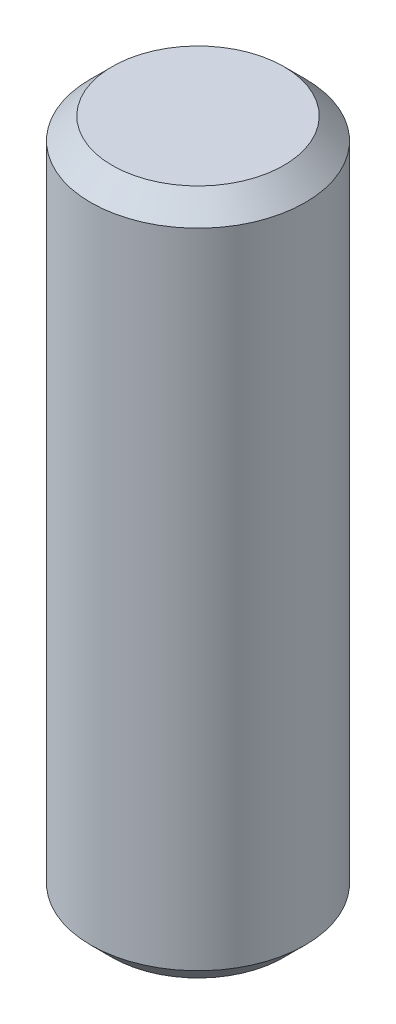
ISO-10303-21;
HEADER;
FILE_DESCRIPTION(('STEP AP214'),'2;1');
FILE_NAME('part.step','',(''),(''),'','','');
FILE_SCHEMA(('AUTOMOTIVE_DESIGN { 1 0 10303 214 1 1 1 1 }'));
ENDSEC;
DATA;
#1=APPLICATION_CONTEXT('core data for automotive mechanical design processes');
#2=APPLICATION_PROTOCOL_DEFINITION('international standard','automotive_design',2000,#1);
#3=PRODUCT_CONTEXT('',#1,'mechanical');
#4=PRODUCT('Part','Part','',(#3));
#5=PRODUCT_RELATED_PRODUCT_CATEGORY('part','',(#4));
#6=PRODUCT_DEFINITION_FORMATION('','',#4);
#7=PRODUCT_DEFINITION_CONTEXT('part definition',#1,'design');
#8=PRODUCT_DEFINITION('design','',#6,#7);
#9=PRODUCT_DEFINITION_SHAPE('','',#8);
#10=(LENGTH_UNIT() NAMED_UNIT(*) SI_UNIT(.MILLI.,.METRE.));
#11=(NAMED_UNIT(*) PLANE_ANGLE_UNIT() SI_UNIT($,.RADIAN.));
#12=(NAMED_UNIT(*) SI_UNIT($,.STERADIAN.) SOLID_ANGLE_UNIT());
#13=UNCERTAINTY_MEASURE_WITH_UNIT(LENGTH_MEASURE(1.E-05),#10,'distance_accuracy_value','');
#14=(GEOMETRIC_REPRESENTATION_CONTEXT(3) GLOBAL_UNCERTAINTY_ASSIGNED_CONTEXT((#13)) GLOBAL_UNIT_ASSIGNED_CONTEXT((#10,
#11,#12)) REPRESENTATION_CONTEXT('',''));
#15=CARTESIAN_POINT('',(0.,0.,0.));
#16=DIRECTION('',(0.,0.,1.));
#17=DIRECTION('',(1.,0.,0.));
#18=AXIS2_PLACEMENT_3D('',#15,#16,#17);
#19=CARTESIAN_POINT('',(0.,16.,0.));
#20=DIRECTION('',(0.,-1.,0.));
#21=DIRECTION('',(0.,0.,-1.));
#22=AXIS2_PLACEMENT_3D('',#19,#20,#21);
#23=CYLINDRICAL_SURFACE('',#22,2.5);
#24=CARTESIAN_POINT('',(0.,15.5,0.));
#25=DIRECTION('',(0.,1.,0.));
#26=DIRECTION('',(0.,0.,1.));
#27=AXIS2_PLACEMENT_3D('',#24,#25,#26);
#28=CIRCLE('',#27,2.5);
#29=CARTESIAN_POINT('',(0.,15.5,2.5));
#30=VERTEX_POINT('',#29);
#31=EDGE_CURVE('E41',#30,#30,#28,.F.);
#32=ORIENTED_EDGE('',*,*,#31,.T.);
#33=EDGE_LOOP('',(#32));
#34=FACE_BOUND('',#33,.T.);
#35=CARTESIAN_POINT('',(0.,0.5,0.));
#36=DIRECTION('',(0.,1.,0.));
#37=DIRECTION('',(0.,0.,1.));
#38=AXIS2_PLACEMENT_3D('',#35,#36,#37);
#39=CIRCLE('',#38,2.5);
#40=CARTESIAN_POINT('',(0.,0.5,2.5));
#41=VERTEX_POINT('',#40);
#42=EDGE_CURVE('E45',#41,#41,#39,.T.);
#43=ORIENTED_EDGE('',*,*,#42,.T.);
#44=EDGE_LOOP('',(#43));
#45=FACE_BOUND('',#44,.T.);
#46=ADVANCED_FACE('F33',(#34,#45),#23,.T.);
#47=CARTESIAN_POINT('',(0.,16.,0.));
#48=DIRECTION('',(0.,1.,0.));
#49=DIRECTION('',(0.,0.,1.));
#50=AXIS2_PLACEMENT_3D('',#47,#48,#49);
#51=PLANE('',#50);
#52=CARTESIAN_POINT('',(0.,16.,0.));
#53=DIRECTION('',(0.,1.,0.));
#54=DIRECTION('',(0.,0.,1.));
#55=AXIS2_PLACEMENT_3D('',#52,#53,#54);
#56=CIRCLE('',#55,2.);
#57=CARTESIAN_POINT('',(0.,16.,2.));
#58=VERTEX_POINT('',#57);
#59=EDGE_CURVE('E49',#58,#58,#56,.T.);
#60=ORIENTED_EDGE('',*,*,#59,.T.);
#61=EDGE_LOOP('',(#60));
#62=FACE_BOUND('',#61,.T.);
#63=ADVANCED_FACE('F55',(#62),#51,.T.);
#64=CARTESIAN_POINT('',(0.,0.,0.));
#65=DIRECTION('',(0.,1.,0.));
#66=DIRECTION('',(0.,0.,1.));
#67=AXIS2_PLACEMENT_3D('',#64,#65,#66);
#68=PLANE('',#67);
#69=CARTESIAN_POINT('',(0.,0.,0.));
#70=DIRECTION('',(0.,1.,0.));
#71=DIRECTION('',(0.,0.,1.));
#72=AXIS2_PLACEMENT_3D('',#69,#70,#71);
#73=CIRCLE('',#72,2.);
#74=CARTESIAN_POINT('',(0.,0.,2.));
#75=VERTEX_POINT('',#74);
#76=EDGE_CURVE('E10',#75,#75,#73,.F.);
#77=ORIENTED_EDGE('',*,*,#76,.T.);
#78=EDGE_LOOP('',(#77));
#79=FACE_BOUND('',#78,.T.);
#80=ADVANCED_FACE('F59',(#79),#68,.F.);
#81=CARTESIAN_POINT('',(0.,16.,0.));
#82=DIRECTION('',(0.,-1.,0.));
#83=DIRECTION('',(0.,0.,-1.));
#84=AXIS2_PLACEMENT_3D('',#81,#82,#83);
#85=CONICAL_SURFACE('',#84,2.,0.785398163397446);
#86=ORIENTED_EDGE('',*,*,#31,.F.);
#87=EDGE_LOOP('',(#86));
#88=FACE_BOUND('',#87,.T.);
#89=ORIENTED_EDGE('',*,*,#59,.F.);
#90=EDGE_LOOP('',(#89));
#91=FACE_BOUND('',#90,.T.);
#92=ADVANCED_FACE('F57',(#88,#91),#85,.T.);
#93=CARTESIAN_POINT('',(0.,0.5,0.));
#94=DIRECTION('',(0.,1.,0.));
#95=DIRECTION('',(0.,0.,1.));
#96=AXIS2_PLACEMENT_3D('',#93,#94,#95);
#97=CONICAL_SURFACE('',#96,2.5,0.785398163397451);
#98=ORIENTED_EDGE('',*,*,#76,.F.);
#99=EDGE_LOOP('',(#98));
#100=FACE_BOUND('',#99,.T.);
#101=ORIENTED_EDGE('',*,*,#42,.F.);
#102=EDGE_LOOP('',(#101));
#103=FACE_BOUND('',#102,.T.);
#104=ADVANCED_FACE('F36',(#100,#103),#97,.T.);
#105=CLOSED_SHELL('',(#46,#63,#80,#92,#104));
#106=MANIFOLD_SOLID_BREP('B2',#105);
#107=ADVANCED_BREP_SHAPE_REPRESENTATION('',(#18,#106),#14);
#108=SHAPE_DEFINITION_REPRESENTATION(#9,#107);
ENDSEC;
END-ISO-10303-21;
